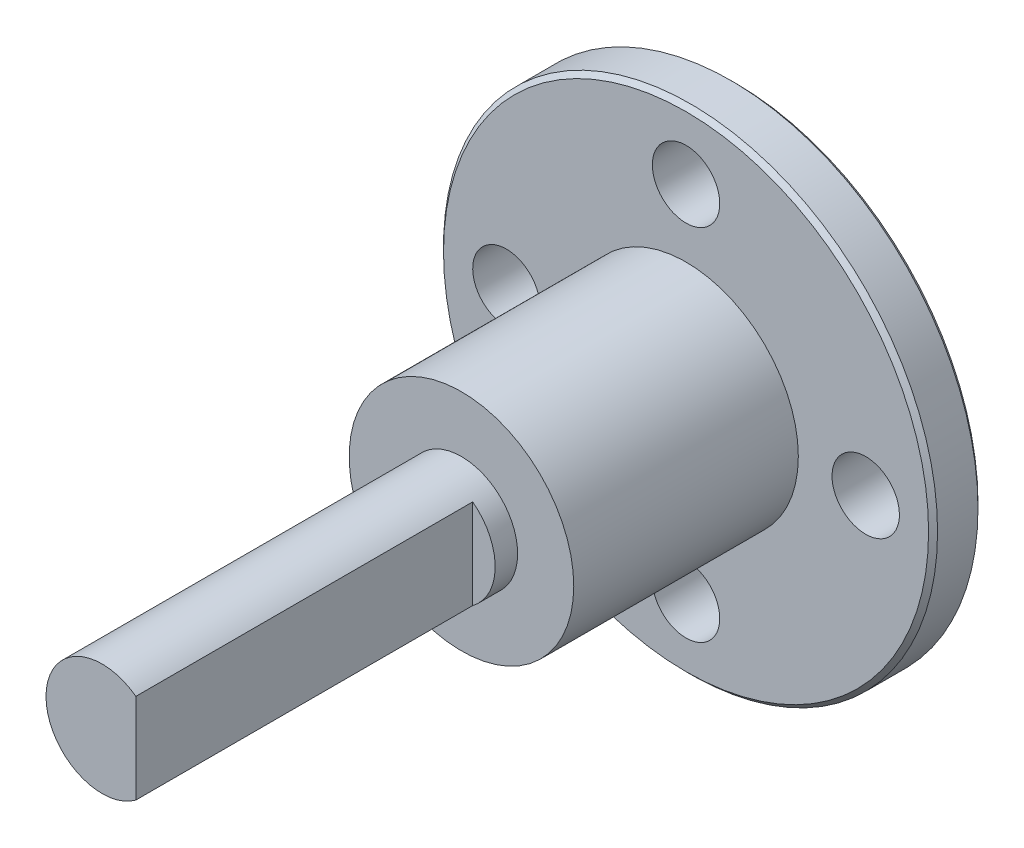
ISO-10303-21;
HEADER;
FILE_DESCRIPTION(('STEP AP214'),'2;1');
FILE_NAME('part.step','',(''),(''),'','','');
FILE_SCHEMA(('AUTOMOTIVE_DESIGN { 1 0 10303 214 1 1 1 1 }'));
ENDSEC;
DATA;
#1=APPLICATION_CONTEXT('core data for automotive mechanical design processes');
#2=APPLICATION_PROTOCOL_DEFINITION('international standard','automotive_design',2000,#1);
#3=PRODUCT_CONTEXT('',#1,'mechanical');
#4=PRODUCT('Part','Part','',(#3));
#5=PRODUCT_RELATED_PRODUCT_CATEGORY('part','',(#4));
#6=PRODUCT_DEFINITION_FORMATION('','',#4);
#7=PRODUCT_DEFINITION_CONTEXT('part definition',#1,'design');
#8=PRODUCT_DEFINITION('design','',#6,#7);
#9=PRODUCT_DEFINITION_SHAPE('','',#8);
#10=(LENGTH_UNIT() NAMED_UNIT(*) SI_UNIT(.MILLI.,.METRE.));
#11=(NAMED_UNIT(*) PLANE_ANGLE_UNIT() SI_UNIT($,.RADIAN.));
#12=(NAMED_UNIT(*) SI_UNIT($,.STERADIAN.) SOLID_ANGLE_UNIT());
#13=UNCERTAINTY_MEASURE_WITH_UNIT(LENGTH_MEASURE(1.E-05),#10,'distance_accuracy_value','');
#14=(GEOMETRIC_REPRESENTATION_CONTEXT(3) GLOBAL_UNCERTAINTY_ASSIGNED_CONTEXT((#13)) GLOBAL_UNIT_ASSIGNED_CONTEXT((#10,
#11,#12)) REPRESENTATION_CONTEXT('',''));
#15=CARTESIAN_POINT('',(0.,0.,0.));
#16=DIRECTION('',(0.,0.,1.));
#17=DIRECTION('',(1.,0.,0.));
#18=AXIS2_PLACEMENT_3D('',#15,#16,#17);
#19=CARTESIAN_POINT('',(0.,0.,2.2));
#20=DIRECTION('',(0.,0.,-1.));
#21=DIRECTION('',(-1.,0.,0.));
#22=AXIS2_PLACEMENT_3D('',#19,#20,#21);
#23=CYLINDRICAL_SURFACE('',#22,11.);
#24=CARTESIAN_POINT('',(0.,0.,0.200000000000002));
#25=DIRECTION('',(0.,0.,1.));
#26=DIRECTION('',(1.,0.,0.));
#27=AXIS2_PLACEMENT_3D('',#24,#25,#26);
#28=CIRCLE('',#27,11.);
#29=CARTESIAN_POINT('',(11.,0.,0.200000000000002));
#30=VERTEX_POINT('',#29);
#31=EDGE_CURVE('E144',#30,#30,#28,.T.);
#32=ORIENTED_EDGE('',*,*,#31,.T.);
#33=EDGE_LOOP('',(#32));
#34=FACE_BOUND('',#33,.T.);
#35=CARTESIAN_POINT('',(0.,0.,2.));
#36=DIRECTION('',(0.,0.,1.));
#37=DIRECTION('',(1.,0.,0.));
#38=AXIS2_PLACEMENT_3D('',#35,#36,#37);
#39=CIRCLE('',#38,11.);
#40=CARTESIAN_POINT('',(11.,0.,2.));
#41=VERTEX_POINT('',#40);
#42=EDGE_CURVE('E140',#41,#41,#39,.F.);
#43=ORIENTED_EDGE('',*,*,#42,.T.);
#44=EDGE_LOOP('',(#43));
#45=FACE_BOUND('',#44,.T.);
#46=ADVANCED_FACE('F49',(#34,#45),#23,.T.);
#47=CARTESIAN_POINT('',(0.,0.,2.2));
#48=DIRECTION('',(0.,0.,1.));
#49=DIRECTION('',(1.,0.,0.));
#50=AXIS2_PLACEMENT_3D('',#47,#48,#49);
#51=PLANE('',#50);
#52=CARTESIAN_POINT('',(0.,0.,2.2));
#53=DIRECTION('',(0.,0.,1.));
#54=DIRECTION('',(1.,0.,0.));
#55=AXIS2_PLACEMENT_3D('',#52,#53,#54);
#56=CIRCLE('',#55,10.8);
#57=CARTESIAN_POINT('',(10.8,0.,2.2));
#58=VERTEX_POINT('',#57);
#59=EDGE_CURVE('E11',#58,#58,#56,.T.);
#60=ORIENTED_EDGE('',*,*,#59,.T.);
#61=EDGE_LOOP('',(#60));
#62=FACE_BOUND('',#61,.T.);
#63=CARTESIAN_POINT('',(8.,0.,2.2));
#64=DIRECTION('',(0.,0.,1.));
#65=DIRECTION('',(0.,-1.,0.));
#66=AXIS2_PLACEMENT_3D('',#63,#64,#65);
#67=CIRCLE('',#66,1.5);
#68=CARTESIAN_POINT('',(7.99999999999999,-1.50000000000003,2.2));
#69=VERTEX_POINT('',#68);
#70=EDGE_CURVE('E105',#69,#69,#67,.T.);
#71=ORIENTED_EDGE('',*,*,#70,.F.);
#72=EDGE_LOOP('',(#71));
#73=FACE_BOUND('',#72,.T.);
#74=CARTESIAN_POINT('',(0.,-8.,2.2));
#75=DIRECTION('',(0.,0.,1.));
#76=DIRECTION('',(-1.,0.,0.));
#77=AXIS2_PLACEMENT_3D('',#74,#75,#76);
#78=CIRCLE('',#77,1.5);
#79=CARTESIAN_POINT('',(-1.5,-8.,2.2));
#80=VERTEX_POINT('',#79);
#81=EDGE_CURVE('E106',#80,#80,#78,.T.);
#82=ORIENTED_EDGE('',*,*,#81,.F.);
#83=EDGE_LOOP('',(#82));
#84=FACE_BOUND('',#83,.T.);
#85=CARTESIAN_POINT('',(-8.,0.,2.2));
#86=DIRECTION('',(0.,0.,1.));
#87=DIRECTION('',(0.,1.,0.));
#88=AXIS2_PLACEMENT_3D('',#85,#86,#87);
#89=CIRCLE('',#88,1.5);
#90=CARTESIAN_POINT('',(-7.99999999999998,1.50000000000008,2.2));
#91=VERTEX_POINT('',#90);
#92=EDGE_CURVE('E115',#91,#91,#89,.T.);
#93=ORIENTED_EDGE('',*,*,#92,.F.);
#94=EDGE_LOOP('',(#93));
#95=FACE_BOUND('',#94,.T.);
#96=CARTESIAN_POINT('',(0.,8.,2.2));
#97=DIRECTION('',(0.,0.,1.));
#98=DIRECTION('',(1.,0.,0.));
#99=AXIS2_PLACEMENT_3D('',#96,#97,#98);
#100=CIRCLE('',#99,1.5);
#101=CARTESIAN_POINT('',(1.5,8.,2.2));
#102=VERTEX_POINT('',#101);
#103=EDGE_CURVE('E110',#102,#102,#100,.T.);
#104=ORIENTED_EDGE('',*,*,#103,.F.);
#105=EDGE_LOOP('',(#104));
#106=FACE_BOUND('',#105,.T.);
#107=CARTESIAN_POINT('',(0.,0.,2.2));
#108=DIRECTION('',(0.,0.,1.));
#109=DIRECTION('',(1.,0.,0.));
#110=AXIS2_PLACEMENT_3D('',#107,#108,#109);
#111=CIRCLE('',#110,5.);
#112=CARTESIAN_POINT('',(5.,0.,2.2));
#113=VERTEX_POINT('',#112);
#114=EDGE_CURVE('E136',#113,#113,#111,.T.);
#115=ORIENTED_EDGE('',*,*,#114,.F.);
#116=EDGE_LOOP('',(#115));
#117=FACE_BOUND('',#116,.T.);
#118=ADVANCED_FACE('F163',(#62,#73,#84,#95,#106,#117),#51,.T.);
#119=CARTESIAN_POINT('',(0.,0.,0.));
#120=DIRECTION('',(0.,0.,1.));
#121=DIRECTION('',(1.,0.,0.));
#122=AXIS2_PLACEMENT_3D('',#119,#120,#121);
#123=PLANE('',#122);
#124=CARTESIAN_POINT('',(0.,0.,0.));
#125=DIRECTION('',(0.,0.,1.));
#126=DIRECTION('',(1.,0.,0.));
#127=AXIS2_PLACEMENT_3D('',#124,#125,#126);
#128=CIRCLE('',#127,10.8);
#129=CARTESIAN_POINT('',(10.8,0.,0.));
#130=VERTEX_POINT('',#129);
#131=EDGE_CURVE('E60',#130,#130,#128,.F.);
#132=ORIENTED_EDGE('',*,*,#131,.T.);
#133=EDGE_LOOP('',(#132));
#134=FACE_BOUND('',#133,.T.);
#135=CARTESIAN_POINT('',(8.,0.,0.));
#136=DIRECTION('',(0.,0.,1.));
#137=DIRECTION('',(0.,-1.,0.));
#138=AXIS2_PLACEMENT_3D('',#135,#136,#137);
#139=CIRCLE('',#138,1.5);
#140=CARTESIAN_POINT('',(7.99999999999999,-1.50000000000003,0.));
#141=VERTEX_POINT('',#140);
#142=EDGE_CURVE('E101',#141,#141,#139,.T.);
#143=ORIENTED_EDGE('',*,*,#142,.T.);
#144=EDGE_LOOP('',(#143));
#145=FACE_BOUND('',#144,.T.);
#146=CARTESIAN_POINT('',(0.,-8.,0.));
#147=DIRECTION('',(0.,0.,1.));
#148=DIRECTION('',(-1.,0.,0.));
#149=AXIS2_PLACEMENT_3D('',#146,#147,#148);
#150=CIRCLE('',#149,1.5);
#151=CARTESIAN_POINT('',(-1.5,-8.,0.));
#152=VERTEX_POINT('',#151);
#153=EDGE_CURVE('E111',#152,#152,#150,.T.);
#154=ORIENTED_EDGE('',*,*,#153,.T.);
#155=EDGE_LOOP('',(#154));
#156=FACE_BOUND('',#155,.T.);
#157=CARTESIAN_POINT('',(-8.,0.,0.));
#158=DIRECTION('',(0.,0.,1.));
#159=DIRECTION('',(0.,1.,0.));
#160=AXIS2_PLACEMENT_3D('',#157,#158,#159);
#161=CIRCLE('',#160,1.5);
#162=CARTESIAN_POINT('',(-7.99999999999998,1.50000000000008,0.));
#163=VERTEX_POINT('',#162);
#164=EDGE_CURVE('E98',#163,#163,#161,.T.);
#165=ORIENTED_EDGE('',*,*,#164,.T.);
#166=EDGE_LOOP('',(#165));
#167=FACE_BOUND('',#166,.T.);
#168=CARTESIAN_POINT('',(0.,8.,0.));
#169=DIRECTION('',(0.,0.,1.));
#170=DIRECTION('',(1.,0.,0.));
#171=AXIS2_PLACEMENT_3D('',#168,#169,#170);
#172=CIRCLE('',#171,1.5);
#173=CARTESIAN_POINT('',(1.5,8.,0.));
#174=VERTEX_POINT('',#173);
#175=EDGE_CURVE('E128',#174,#174,#172,.T.);
#176=ORIENTED_EDGE('',*,*,#175,.T.);
#177=EDGE_LOOP('',(#176));
#178=FACE_BOUND('',#177,.T.);
#179=ADVANCED_FACE('F152',(#134,#145,#156,#167,#178),#123,.F.);
#180=CARTESIAN_POINT('',(0.,0.,12.2));
#181=DIRECTION('',(0.,0.,-1.));
#182=DIRECTION('',(-1.,0.,0.));
#183=AXIS2_PLACEMENT_3D('',#180,#181,#182);
#184=CYLINDRICAL_SURFACE('',#183,5.);
#185=CARTESIAN_POINT('',(0.,0.,12.2));
#186=DIRECTION('',(0.,0.,1.));
#187=DIRECTION('',(1.,0.,0.));
#188=AXIS2_PLACEMENT_3D('',#185,#186,#187);
#189=CIRCLE('',#188,5.);
#190=CARTESIAN_POINT('',(5.,0.,12.2));
#191=VERTEX_POINT('',#190);
#192=EDGE_CURVE('E132',#191,#191,#189,.T.);
#193=ORIENTED_EDGE('',*,*,#192,.F.);
#194=EDGE_LOOP('',(#193));
#195=FACE_BOUND('',#194,.T.);
#196=ORIENTED_EDGE('',*,*,#114,.T.);
#197=EDGE_LOOP('',(#196));
#198=FACE_BOUND('',#197,.T.);
#199=ADVANCED_FACE('F184',(#195,#198),#184,.T.);
#200=CARTESIAN_POINT('',(0.,0.,12.2));
#201=DIRECTION('',(0.,0.,1.));
#202=DIRECTION('',(1.,0.,0.));
#203=AXIS2_PLACEMENT_3D('',#200,#201,#202);
#204=PLANE('',#203);
#205=CARTESIAN_POINT('',(0.,0.,12.2));
#206=DIRECTION('',(0.,0.,1.));
#207=DIRECTION('',(1.,0.,0.));
#208=AXIS2_PLACEMENT_3D('',#205,#206,#207);
#209=CIRCLE('',#208,2.5);
#210=CARTESIAN_POINT('',(2.5,0.,12.2));
#211=VERTEX_POINT('',#210);
#212=EDGE_CURVE('E54',#211,#211,#209,.F.);
#213=ORIENTED_EDGE('',*,*,#212,.T.);
#214=EDGE_LOOP('',(#213));
#215=FACE_BOUND('',#214,.T.);
#216=ORIENTED_EDGE('',*,*,#192,.T.);
#217=EDGE_LOOP('',(#216));
#218=FACE_BOUND('',#217,.T.);
#219=ADVANCED_FACE('F186',(#215,#218),#204,.T.);
#220=CARTESIAN_POINT('',(0.,8.,2.2));
#221=DIRECTION('',(0.,0.,1.));
#222=DIRECTION('',(1.,0.,0.));
#223=AXIS2_PLACEMENT_3D('',#220,#221,#222);
#224=CYLINDRICAL_SURFACE('',#223,1.5);
#225=ORIENTED_EDGE('',*,*,#175,.F.);
#226=EDGE_LOOP('',(#225));
#227=FACE_BOUND('',#226,.T.);
#228=ORIENTED_EDGE('',*,*,#103,.T.);
#229=EDGE_LOOP('',(#228));
#230=FACE_BOUND('',#229,.T.);
#231=ADVANCED_FACE('F193',(#227,#230),#224,.F.);
#232=CARTESIAN_POINT('',(-8.,0.,2.2));
#233=DIRECTION('',(0.,0.,1.));
#234=DIRECTION('',(0.,1.,0.));
#235=AXIS2_PLACEMENT_3D('',#232,#233,#234);
#236=CYLINDRICAL_SURFACE('',#235,1.5);
#237=ORIENTED_EDGE('',*,*,#164,.F.);
#238=EDGE_LOOP('',(#237));
#239=FACE_BOUND('',#238,.T.);
#240=ORIENTED_EDGE('',*,*,#92,.T.);
#241=EDGE_LOOP('',(#240));
#242=FACE_BOUND('',#241,.T.);
#243=ADVANCED_FACE('F206',(#239,#242),#236,.F.);
#244=CARTESIAN_POINT('',(0.,-8.,2.2));
#245=DIRECTION('',(0.,0.,1.));
#246=DIRECTION('',(-1.,0.,0.));
#247=AXIS2_PLACEMENT_3D('',#244,#245,#246);
#248=CYLINDRICAL_SURFACE('',#247,1.5);
#249=ORIENTED_EDGE('',*,*,#153,.F.);
#250=EDGE_LOOP('',(#249));
#251=FACE_BOUND('',#250,.T.);
#252=ORIENTED_EDGE('',*,*,#81,.T.);
#253=EDGE_LOOP('',(#252));
#254=FACE_BOUND('',#253,.T.);
#255=ADVANCED_FACE('F210',(#251,#254),#248,.F.);
#256=CARTESIAN_POINT('',(8.,0.,2.2));
#257=DIRECTION('',(0.,0.,1.));
#258=DIRECTION('',(0.,-1.,0.));
#259=AXIS2_PLACEMENT_3D('',#256,#257,#258);
#260=CYLINDRICAL_SURFACE('',#259,1.5);
#261=ORIENTED_EDGE('',*,*,#142,.F.);
#262=EDGE_LOOP('',(#261));
#263=FACE_BOUND('',#262,.T.);
#264=ORIENTED_EDGE('',*,*,#70,.T.);
#265=EDGE_LOOP('',(#264));
#266=FACE_BOUND('',#265,.T.);
#267=ADVANCED_FACE('F158',(#263,#266),#260,.F.);
#268=CARTESIAN_POINT('',(0.,0.,0.200000000000002));
#269=DIRECTION('',(0.,0.,1.));
#270=DIRECTION('',(1.,0.,0.));
#271=AXIS2_PLACEMENT_3D('',#268,#269,#270);
#272=CONICAL_SURFACE('',#271,11.,0.785398163397444);
#273=ORIENTED_EDGE('',*,*,#131,.F.);
#274=EDGE_LOOP('',(#273));
#275=FACE_BOUND('',#274,.T.);
#276=ORIENTED_EDGE('',*,*,#31,.F.);
#277=EDGE_LOOP('',(#276));
#278=FACE_BOUND('',#277,.T.);
#279=ADVANCED_FACE('F155',(#275,#278),#272,.T.);
#280=CARTESIAN_POINT('',(0.,0.,2.2));
#281=DIRECTION('',(0.,0.,-1.));
#282=DIRECTION('',(-1.,0.,0.));
#283=AXIS2_PLACEMENT_3D('',#280,#281,#282);
#284=CONICAL_SURFACE('',#283,10.8,0.785398163397457);
#285=ORIENTED_EDGE('',*,*,#42,.F.);
#286=EDGE_LOOP('',(#285));
#287=FACE_BOUND('',#286,.T.);
#288=ORIENTED_EDGE('',*,*,#59,.F.);
#289=EDGE_LOOP('',(#288));
#290=FACE_BOUND('',#289,.T.);
#291=ADVANCED_FACE('F52',(#287,#290),#284,.T.);
#292=CARTESIAN_POINT('',(0.,0.,28.2));
#293=DIRECTION('',(0.,0.,-1.));
#294=DIRECTION('',(-1.,0.,0.));
#295=AXIS2_PLACEMENT_3D('',#292,#293,#294);
#296=CYLINDRICAL_SURFACE('',#295,2.5);
#297=CARTESIAN_POINT('',(0.,0.,28.2));
#298=DIRECTION('',(0.,0.,1.));
#299=DIRECTION('',(1.,0.,0.));
#300=AXIS2_PLACEMENT_3D('',#297,#298,#299);
#301=CIRCLE('',#300,2.5);
#302=CARTESIAN_POINT('',(1.5,2.,28.2));
#303=VERTEX_POINT('',#302);
#304=CARTESIAN_POINT('',(1.5,-2.,28.2));
#305=VERTEX_POINT('',#304);
#306=EDGE_CURVE('E90',#303,#305,#301,.T.);
#307=ORIENTED_EDGE('',*,*,#306,.F.);
#308=DIRECTION('',(0.,0.,1.));
#309=VECTOR('',#308,1.);
#310=CARTESIAN_POINT('',(1.5,2.,13.2));
#311=LINE('',#310,#309);
#312=CARTESIAN_POINT('',(1.5,2.,13.2));
#313=VERTEX_POINT('',#312);
#314=EDGE_CURVE('E67',#313,#303,#311,.T.);
#315=ORIENTED_EDGE('',*,*,#314,.F.);
#316=CARTESIAN_POINT('',(0.,0.,13.2));
#317=DIRECTION('',(0.,0.,1.));
#318=DIRECTION('',(1.,0.,0.));
#319=AXIS2_PLACEMENT_3D('',#316,#317,#318);
#320=CIRCLE('',#319,2.5);
#321=CARTESIAN_POINT('',(1.5,-2.,13.2));
#322=VERTEX_POINT('',#321);
#323=EDGE_CURVE('E84',#322,#313,#320,.T.);
#324=ORIENTED_EDGE('',*,*,#323,.F.);
#325=DIRECTION('',(0.,0.,1.));
#326=VECTOR('',#325,1.);
#327=CARTESIAN_POINT('',(1.5,-2.,13.2));
#328=LINE('',#327,#326);
#329=EDGE_CURVE('E73',#322,#305,#328,.T.);
#330=ORIENTED_EDGE('',*,*,#329,.T.);
#331=EDGE_LOOP('',(#307,#315,#324,#330));
#332=FACE_BOUND('',#331,.T.);
#333=ORIENTED_EDGE('',*,*,#212,.F.);
#334=EDGE_LOOP('',(#333));
#335=FACE_BOUND('',#334,.T.);
#336=ADVANCED_FACE('F88',(#332,#335),#296,.T.);
#337=CARTESIAN_POINT('',(0.,0.,28.2));
#338=DIRECTION('',(0.,0.,1.));
#339=DIRECTION('',(1.,0.,0.));
#340=AXIS2_PLACEMENT_3D('',#337,#338,#339);
#341=PLANE('',#340);
#342=DIRECTION('',(0.,-1.,0.));
#343=VECTOR('',#342,1.);
#344=CARTESIAN_POINT('',(1.5,0.,28.2));
#345=LINE('',#344,#343);
#346=EDGE_CURVE('E78',#303,#305,#345,.T.);
#347=ORIENTED_EDGE('',*,*,#346,.F.);
#348=ORIENTED_EDGE('',*,*,#306,.T.);
#349=EDGE_LOOP('',(#347,#348));
#350=FACE_BOUND('',#349,.T.);
#351=ADVANCED_FACE('F93',(#350),#341,.T.);
#352=CARTESIAN_POINT('',(1.5,0.,13.2));
#353=DIRECTION('',(-1.,0.,0.));
#354=DIRECTION('',(0.,0.,1.));
#355=AXIS2_PLACEMENT_3D('',#352,#353,#354);
#356=PLANE('',#355);
#357=ORIENTED_EDGE('',*,*,#346,.T.);
#358=ORIENTED_EDGE('',*,*,#329,.F.);
#359=DIRECTION('',(0.,-1.,0.));
#360=VECTOR('',#359,1.);
#361=CARTESIAN_POINT('',(1.5,0.,13.2));
#362=LINE('',#361,#360);
#363=EDGE_CURVE('E229',#313,#322,#362,.T.);
#364=ORIENTED_EDGE('',*,*,#363,.F.);
#365=ORIENTED_EDGE('',*,*,#314,.T.);
#366=EDGE_LOOP('',(#357,#358,#364,#365));
#367=FACE_BOUND('',#366,.T.);
#368=ADVANCED_FACE('F79',(#367),#356,.F.);
#369=CARTESIAN_POINT('',(0.,0.,13.2));
#370=DIRECTION('',(0.,0.,1.));
#371=DIRECTION('',(1.,0.,0.));
#372=AXIS2_PLACEMENT_3D('',#369,#370,#371);
#373=PLANE('',#372);
#374=ORIENTED_EDGE('',*,*,#323,.T.);
#375=ORIENTED_EDGE('',*,*,#363,.T.);
#376=EDGE_LOOP('',(#374,#375));
#377=FACE_BOUND('',#376,.T.);
#378=ADVANCED_FACE('F224',(#377),#373,.T.);
#379=CLOSED_SHELL('',(#46,#118,#179,#199,#219,#231,#243,#255,#267,#279,#291,#336,#351,#368,#378));
#380=MANIFOLD_SOLID_BREP('B2',#379);
#381=ADVANCED_BREP_SHAPE_REPRESENTATION('',(#18,#380),#14);
#382=SHAPE_DEFINITION_REPRESENTATION(#9,#381);
ENDSEC;
END-ISO-10303-21;
